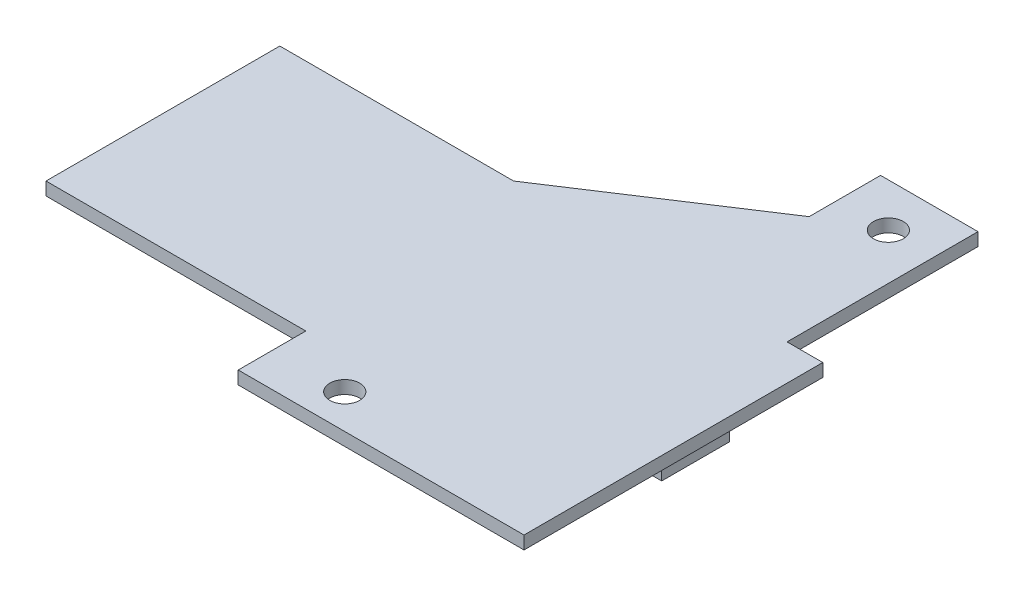
ISO-10303-21;
HEADER;
FILE_DESCRIPTION(('STEP AP214'),'2;1');
FILE_NAME('part.step','',(''),(''),'','','');
FILE_SCHEMA(('AUTOMOTIVE_DESIGN { 1 0 10303 214 1 1 1 1 }'));
ENDSEC;
DATA;
#1=APPLICATION_CONTEXT('core data for automotive mechanical design processes');
#2=APPLICATION_PROTOCOL_DEFINITION('international standard','automotive_design',2000,#1);
#3=PRODUCT_CONTEXT('',#1,'mechanical');
#4=PRODUCT('Part','Part','',(#3));
#5=PRODUCT_RELATED_PRODUCT_CATEGORY('part','',(#4));
#6=PRODUCT_DEFINITION_FORMATION('','',#4);
#7=PRODUCT_DEFINITION_CONTEXT('part definition',#1,'design');
#8=PRODUCT_DEFINITION('design','',#6,#7);
#9=PRODUCT_DEFINITION_SHAPE('','',#8);
#10=(LENGTH_UNIT() NAMED_UNIT(*) SI_UNIT(.MILLI.,.METRE.));
#11=(NAMED_UNIT(*) PLANE_ANGLE_UNIT() SI_UNIT($,.RADIAN.));
#12=(NAMED_UNIT(*) SI_UNIT($,.STERADIAN.) SOLID_ANGLE_UNIT());
#13=UNCERTAINTY_MEASURE_WITH_UNIT(LENGTH_MEASURE(1.E-05),#10,'distance_accuracy_value','');
#14=(GEOMETRIC_REPRESENTATION_CONTEXT(3) GLOBAL_UNCERTAINTY_ASSIGNED_CONTEXT((#13)) GLOBAL_UNIT_ASSIGNED_CONTEXT((#10,
#11,#12)) REPRESENTATION_CONTEXT('',''));
#15=CARTESIAN_POINT('',(0.,0.,0.));
#16=DIRECTION('',(0.,0.,1.));
#17=DIRECTION('',(1.,0.,0.));
#18=AXIS2_PLACEMENT_3D('',#15,#16,#17);
#19=CARTESIAN_POINT('',(0.,0.,0.));
#20=DIRECTION('',(0.,-1.,0.));
#21=DIRECTION('',(0.,0.,-1.));
#22=AXIS2_PLACEMENT_3D('',#19,#20,#21);
#23=PLANE('',#22);
#24=CARTESIAN_POINT('',(25.55,0.,2.55));
#25=DIRECTION('',(0.,1.,0.));
#26=DIRECTION('',(0.,0.,1.));
#27=AXIS2_PLACEMENT_3D('',#24,#25,#26);
#28=CIRCLE('',#27,1.15);
#29=CARTESIAN_POINT('',(25.55,0.,3.7));
#30=VERTEX_POINT('',#29);
#31=EDGE_CURVE('E254',#30,#30,#28,.T.);
#32=ORIENTED_EDGE('',*,*,#31,.T.);
#33=EDGE_LOOP('',(#32));
#34=FACE_BOUND('',#33,.T.);
#35=CARTESIAN_POINT('',(35.7,0.,-29.15));
#36=DIRECTION('',(0.,1.,0.));
#37=DIRECTION('',(0.,0.,1.));
#38=AXIS2_PLACEMENT_3D('',#35,#36,#37);
#39=CIRCLE('',#38,1.15);
#40=CARTESIAN_POINT('',(35.7,0.,-28.));
#41=VERTEX_POINT('',#40);
#42=EDGE_CURVE('E168',#41,#41,#39,.T.);
#43=ORIENTED_EDGE('',*,*,#42,.T.);
#44=EDGE_LOOP('',(#43));
#45=FACE_BOUND('',#44,.T.);
#46=DIRECTION('',(1.,0.,0.));
#47=VECTOR('',#46,1.);
#48=CARTESIAN_POINT('',(20.,0.,0.));
#49=LINE('',#48,#47);
#50=CARTESIAN_POINT('',(0.,0.,0.));
#51=VERTEX_POINT('',#50);
#52=CARTESIAN_POINT('',(20.,0.,0.));
#53=VERTEX_POINT('',#52);
#54=EDGE_CURVE('E164',#51,#53,#49,.T.);
#55=ORIENTED_EDGE('',*,*,#54,.F.);
#56=DIRECTION('',(0.,0.,1.));
#57=VECTOR('',#56,1.);
#58=CARTESIAN_POINT('',(0.,0.,0.));
#59=LINE('',#58,#57);
#60=CARTESIAN_POINT('',(0.,0.,-18.));
#61=VERTEX_POINT('',#60);
#62=EDGE_CURVE('E103',#61,#51,#59,.T.);
#63=ORIENTED_EDGE('',*,*,#62,.F.);
#64=DIRECTION('',(-1.,0.,0.));
#65=VECTOR('',#64,1.);
#66=CARTESIAN_POINT('',(0.,0.,-18.));
#67=LINE('',#66,#65);
#68=CARTESIAN_POINT('',(18.,0.,-18.));
#69=VERTEX_POINT('',#68);
#70=EDGE_CURVE('E183',#69,#61,#67,.T.);
#71=ORIENTED_EDGE('',*,*,#70,.F.);
#72=DIRECTION('',(-0.836701516894204,0.,0.547659174694388));
#73=VECTOR('',#72,1.);
#74=CARTESIAN_POINT('',(18.,0.,-18.));
#75=LINE('',#74,#73);
#76=CARTESIAN_POINT('',(31.75,0.,-27.));
#77=VERTEX_POINT('',#76);
#78=EDGE_CURVE('E152',#77,#69,#75,.T.);
#79=ORIENTED_EDGE('',*,*,#78,.F.);
#80=DIRECTION('',(0.,0.,1.));
#81=VECTOR('',#80,1.);
#82=CARTESIAN_POINT('',(31.75,0.,-27.));
#83=LINE('',#82,#81);
#84=CARTESIAN_POINT('',(31.75,0.,-32.5));
#85=VERTEX_POINT('',#84);
#86=EDGE_CURVE('E180',#85,#77,#83,.T.);
#87=ORIENTED_EDGE('',*,*,#86,.F.);
#88=DIRECTION('',(-1.,0.,0.));
#89=VECTOR('',#88,1.);
#90=CARTESIAN_POINT('',(31.75,0.,-32.5));
#91=LINE('',#90,#89);
#92=CARTESIAN_POINT('',(39.25,0.,-32.5));
#93=VERTEX_POINT('',#92);
#94=EDGE_CURVE('E178',#93,#85,#91,.T.);
#95=ORIENTED_EDGE('',*,*,#94,.F.);
#96=DIRECTION('',(0.,0.,-1.));
#97=VECTOR('',#96,1.);
#98=CARTESIAN_POINT('',(39.25,0.,-32.5));
#99=LINE('',#98,#97);
#100=CARTESIAN_POINT('',(39.25,0.,-17.8));
#101=VERTEX_POINT('',#100);
#102=EDGE_CURVE('E176',#101,#93,#99,.T.);
#103=ORIENTED_EDGE('',*,*,#102,.F.);
#104=DIRECTION('',(-1.,0.,0.));
#105=VECTOR('',#104,1.);
#106=CARTESIAN_POINT('',(39.25,0.,-17.8));
#107=LINE('',#106,#105);
#108=CARTESIAN_POINT('',(42.,0.,-17.8));
#109=VERTEX_POINT('',#108);
#110=EDGE_CURVE('E174',#109,#101,#107,.T.);
#111=ORIENTED_EDGE('',*,*,#110,.F.);
#112=DIRECTION('',(0.,0.,-1.));
#113=VECTOR('',#112,1.);
#114=CARTESIAN_POINT('',(42.,0.,-17.8));
#115=LINE('',#114,#113);
#116=CARTESIAN_POINT('',(42.,0.,5.2));
#117=VERTEX_POINT('',#116);
#118=EDGE_CURVE('E172',#117,#109,#115,.T.);
#119=ORIENTED_EDGE('',*,*,#118,.F.);
#120=DIRECTION('',(1.,0.,0.));
#121=VECTOR('',#120,1.);
#122=CARTESIAN_POINT('',(42.,0.,5.2));
#123=LINE('',#122,#121);
#124=CARTESIAN_POINT('',(20.,0.,5.2));
#125=VERTEX_POINT('',#124);
#126=EDGE_CURVE('E170',#125,#117,#123,.T.);
#127=ORIENTED_EDGE('',*,*,#126,.F.);
#128=DIRECTION('',(0.,0.,1.));
#129=VECTOR('',#128,1.);
#130=CARTESIAN_POINT('',(20.,0.,5.2));
#131=LINE('',#130,#129);
#132=EDGE_CURVE('E167',#53,#125,#131,.T.);
#133=ORIENTED_EDGE('',*,*,#132,.F.);
#134=EDGE_LOOP('',(#55,#63,#71,#79,#87,#95,#103,#111,#119,#127,#133));
#135=FACE_BOUND('',#134,.T.);
#136=DIRECTION('',(1.,0.,0.));
#137=VECTOR('',#136,1.);
#138=CARTESIAN_POINT('',(41.,0.,-11.6));
#139=LINE('',#138,#137);
#140=CARTESIAN_POINT('',(35.8,0.,-11.6));
#141=VERTEX_POINT('',#140);
#142=CARTESIAN_POINT('',(41.,0.,-11.6));
#143=VERTEX_POINT('',#142);
#144=EDGE_CURVE('E278',#141,#143,#139,.T.);
#145=ORIENTED_EDGE('',*,*,#144,.F.);
#146=DIRECTION('',(0.,0.,-1.));
#147=VECTOR('',#146,1.);
#148=CARTESIAN_POINT('',(35.8,0.,-11.6));
#149=LINE('',#148,#147);
#150=CARTESIAN_POINT('',(35.8,0.,-6.4));
#151=VERTEX_POINT('',#150);
#152=EDGE_CURVE('E281',#151,#141,#149,.T.);
#153=ORIENTED_EDGE('',*,*,#152,.F.);
#154=DIRECTION('',(-1.,0.,0.));
#155=VECTOR('',#154,1.);
#156=CARTESIAN_POINT('',(41.,0.,-6.4));
#157=LINE('',#156,#155);
#158=CARTESIAN_POINT('',(41.,0.,-6.4));
#159=VERTEX_POINT('',#158);
#160=EDGE_CURVE('E273',#159,#151,#157,.T.);
#161=ORIENTED_EDGE('',*,*,#160,.F.);
#162=DIRECTION('',(0.,0.,1.));
#163=VECTOR('',#162,1.);
#164=CARTESIAN_POINT('',(41.,0.,-11.6));
#165=LINE('',#164,#163);
#166=EDGE_CURVE('E276',#143,#159,#165,.T.);
#167=ORIENTED_EDGE('',*,*,#166,.F.);
#168=EDGE_LOOP('',(#145,#153,#161,#167));
#169=FACE_BOUND('',#168,.T.);
#170=ADVANCED_FACE('F37',(#34,#45,#135,#169),#23,.T.);
#171=CARTESIAN_POINT('',(20.,1.,0.));
#172=DIRECTION('',(0.,0.,-1.));
#173=DIRECTION('',(-1.,0.,0.));
#174=AXIS2_PLACEMENT_3D('',#171,#172,#173);
#175=PLANE('',#174);
#176=ORIENTED_EDGE('',*,*,#54,.T.);
#177=DIRECTION('',(0.,-1.,0.));
#178=VECTOR('',#177,1.);
#179=CARTESIAN_POINT('',(20.,1.,0.));
#180=LINE('',#179,#178);
#181=CARTESIAN_POINT('',(20.,1.,0.));
#182=VERTEX_POINT('',#181);
#183=EDGE_CURVE('E11',#182,#53,#180,.T.);
#184=ORIENTED_EDGE('',*,*,#183,.F.);
#185=DIRECTION('',(1.,0.,0.));
#186=VECTOR('',#185,1.);
#187=CARTESIAN_POINT('',(20.,1.,0.));
#188=LINE('',#187,#186);
#189=CARTESIAN_POINT('',(0.,1.,0.));
#190=VERTEX_POINT('',#189);
#191=EDGE_CURVE('E186',#190,#182,#188,.T.);
#192=ORIENTED_EDGE('',*,*,#191,.F.);
#193=DIRECTION('',(0.,-1.,0.));
#194=VECTOR('',#193,1.);
#195=CARTESIAN_POINT('',(0.,1.,0.));
#196=LINE('',#195,#194);
#197=EDGE_CURVE('E160',#190,#51,#196,.T.);
#198=ORIENTED_EDGE('',*,*,#197,.T.);
#199=EDGE_LOOP('',(#176,#184,#192,#198));
#200=FACE_BOUND('',#199,.T.);
#201=ADVANCED_FACE('F39',(#200),#175,.F.);
#202=CARTESIAN_POINT('',(20.,1.,5.2));
#203=DIRECTION('',(1.,0.,0.));
#204=DIRECTION('',(0.,0.,-1.));
#205=AXIS2_PLACEMENT_3D('',#202,#203,#204);
#206=PLANE('',#205);
#207=ORIENTED_EDGE('',*,*,#132,.T.);
#208=DIRECTION('',(0.,-1.,0.));
#209=VECTOR('',#208,1.);
#210=CARTESIAN_POINT('',(20.,1.,5.2));
#211=LINE('',#210,#209);
#212=CARTESIAN_POINT('',(20.,1.,5.2));
#213=VERTEX_POINT('',#212);
#214=EDGE_CURVE('E45',#213,#125,#211,.T.);
#215=ORIENTED_EDGE('',*,*,#214,.F.);
#216=DIRECTION('',(0.,0.,1.));
#217=VECTOR('',#216,1.);
#218=CARTESIAN_POINT('',(20.,1.,5.2));
#219=LINE('',#218,#217);
#220=EDGE_CURVE('E111',#182,#213,#219,.T.);
#221=ORIENTED_EDGE('',*,*,#220,.F.);
#222=ORIENTED_EDGE('',*,*,#183,.T.);
#223=EDGE_LOOP('',(#207,#215,#221,#222));
#224=FACE_BOUND('',#223,.T.);
#225=ADVANCED_FACE('F328',(#224),#206,.F.);
#226=CARTESIAN_POINT('',(42.,1.,5.2));
#227=DIRECTION('',(0.,0.,-1.));
#228=DIRECTION('',(-1.,0.,0.));
#229=AXIS2_PLACEMENT_3D('',#226,#227,#228);
#230=PLANE('',#229);
#231=ORIENTED_EDGE('',*,*,#126,.T.);
#232=DIRECTION('',(0.,-1.,0.));
#233=VECTOR('',#232,1.);
#234=CARTESIAN_POINT('',(42.,1.,5.2));
#235=LINE('',#234,#233);
#236=CARTESIAN_POINT('',(42.,1.,5.2));
#237=VERTEX_POINT('',#236);
#238=EDGE_CURVE('E202',#237,#117,#235,.T.);
#239=ORIENTED_EDGE('',*,*,#238,.F.);
#240=DIRECTION('',(1.,0.,0.));
#241=VECTOR('',#240,1.);
#242=CARTESIAN_POINT('',(42.,1.,5.2));
#243=LINE('',#242,#241);
#244=EDGE_CURVE('E210',#213,#237,#243,.T.);
#245=ORIENTED_EDGE('',*,*,#244,.F.);
#246=ORIENTED_EDGE('',*,*,#214,.T.);
#247=EDGE_LOOP('',(#231,#239,#245,#246));
#248=FACE_BOUND('',#247,.T.);
#249=ADVANCED_FACE('F208',(#248),#230,.F.);
#250=CARTESIAN_POINT('',(42.,1.,-17.8));
#251=DIRECTION('',(-1.,0.,0.));
#252=DIRECTION('',(0.,0.,1.));
#253=AXIS2_PLACEMENT_3D('',#250,#251,#252);
#254=PLANE('',#253);
#255=ORIENTED_EDGE('',*,*,#118,.T.);
#256=DIRECTION('',(0.,-1.,0.));
#257=VECTOR('',#256,1.);
#258=CARTESIAN_POINT('',(42.,1.,-17.8));
#259=LINE('',#258,#257);
#260=CARTESIAN_POINT('',(42.,1.,-17.8));
#261=VERTEX_POINT('',#260);
#262=EDGE_CURVE('E199',#261,#109,#259,.T.);
#263=ORIENTED_EDGE('',*,*,#262,.F.);
#264=DIRECTION('',(0.,0.,-1.));
#265=VECTOR('',#264,1.);
#266=CARTESIAN_POINT('',(42.,1.,-17.8));
#267=LINE('',#266,#265);
#268=EDGE_CURVE('E228',#237,#261,#267,.T.);
#269=ORIENTED_EDGE('',*,*,#268,.F.);
#270=ORIENTED_EDGE('',*,*,#238,.T.);
#271=EDGE_LOOP('',(#255,#263,#269,#270));
#272=FACE_BOUND('',#271,.T.);
#273=ADVANCED_FACE('F219',(#272),#254,.F.);
#274=CARTESIAN_POINT('',(39.25,1.,-17.8));
#275=DIRECTION('',(0.,0.,1.));
#276=DIRECTION('',(1.,0.,0.));
#277=AXIS2_PLACEMENT_3D('',#274,#275,#276);
#278=PLANE('',#277);
#279=ORIENTED_EDGE('',*,*,#110,.T.);
#280=DIRECTION('',(0.,-1.,0.));
#281=VECTOR('',#280,1.);
#282=CARTESIAN_POINT('',(39.25,1.,-17.8));
#283=LINE('',#282,#281);
#284=CARTESIAN_POINT('',(39.25,1.,-17.8));
#285=VERTEX_POINT('',#284);
#286=EDGE_CURVE('E196',#285,#101,#283,.T.);
#287=ORIENTED_EDGE('',*,*,#286,.F.);
#288=DIRECTION('',(-1.,0.,0.));
#289=VECTOR('',#288,1.);
#290=CARTESIAN_POINT('',(39.25,1.,-17.8));
#291=LINE('',#290,#289);
#292=EDGE_CURVE('E225',#261,#285,#291,.T.);
#293=ORIENTED_EDGE('',*,*,#292,.F.);
#294=ORIENTED_EDGE('',*,*,#262,.T.);
#295=EDGE_LOOP('',(#279,#287,#293,#294));
#296=FACE_BOUND('',#295,.T.);
#297=ADVANCED_FACE('F223',(#296),#278,.F.);
#298=CARTESIAN_POINT('',(39.25,1.,-32.5));
#299=DIRECTION('',(-1.,0.,0.));
#300=DIRECTION('',(0.,0.,1.));
#301=AXIS2_PLACEMENT_3D('',#298,#299,#300);
#302=PLANE('',#301);
#303=ORIENTED_EDGE('',*,*,#102,.T.);
#304=DIRECTION('',(0.,-1.,0.));
#305=VECTOR('',#304,1.);
#306=CARTESIAN_POINT('',(39.25,1.,-32.5));
#307=LINE('',#306,#305);
#308=CARTESIAN_POINT('',(39.25,1.,-32.5));
#309=VERTEX_POINT('',#308);
#310=EDGE_CURVE('E193',#309,#93,#307,.T.);
#311=ORIENTED_EDGE('',*,*,#310,.F.);
#312=DIRECTION('',(0.,0.,-1.));
#313=VECTOR('',#312,1.);
#314=CARTESIAN_POINT('',(39.25,1.,-32.5));
#315=LINE('',#314,#313);
#316=EDGE_CURVE('E227',#285,#309,#315,.T.);
#317=ORIENTED_EDGE('',*,*,#316,.F.);
#318=ORIENTED_EDGE('',*,*,#286,.T.);
#319=EDGE_LOOP('',(#303,#311,#317,#318));
#320=FACE_BOUND('',#319,.T.);
#321=ADVANCED_FACE('F343',(#320),#302,.F.);
#322=CARTESIAN_POINT('',(31.75,1.,-32.5));
#323=DIRECTION('',(0.,0.,1.));
#324=DIRECTION('',(1.,0.,0.));
#325=AXIS2_PLACEMENT_3D('',#322,#323,#324);
#326=PLANE('',#325);
#327=ORIENTED_EDGE('',*,*,#94,.T.);
#328=DIRECTION('',(0.,-1.,0.));
#329=VECTOR('',#328,1.);
#330=CARTESIAN_POINT('',(31.75,1.,-32.5));
#331=LINE('',#330,#329);
#332=CARTESIAN_POINT('',(31.75,1.,-32.5));
#333=VERTEX_POINT('',#332);
#334=EDGE_CURVE('E190',#333,#85,#331,.T.);
#335=ORIENTED_EDGE('',*,*,#334,.F.);
#336=DIRECTION('',(-1.,0.,0.));
#337=VECTOR('',#336,1.);
#338=CARTESIAN_POINT('',(31.75,1.,-32.5));
#339=LINE('',#338,#337);
#340=EDGE_CURVE('E230',#309,#333,#339,.T.);
#341=ORIENTED_EDGE('',*,*,#340,.F.);
#342=ORIENTED_EDGE('',*,*,#310,.T.);
#343=EDGE_LOOP('',(#327,#335,#341,#342));
#344=FACE_BOUND('',#343,.T.);
#345=ADVANCED_FACE('F239',(#344),#326,.F.);
#346=CARTESIAN_POINT('',(31.75,1.,-27.));
#347=DIRECTION('',(1.,0.,0.));
#348=DIRECTION('',(0.,0.,-1.));
#349=AXIS2_PLACEMENT_3D('',#346,#347,#348);
#350=PLANE('',#349);
#351=ORIENTED_EDGE('',*,*,#86,.T.);
#352=DIRECTION('',(0.,-1.,0.));
#353=VECTOR('',#352,1.);
#354=CARTESIAN_POINT('',(31.75,1.,-27.));
#355=LINE('',#354,#353);
#356=CARTESIAN_POINT('',(31.75,1.,-27.));
#357=VERTEX_POINT('',#356);
#358=EDGE_CURVE('E155',#357,#77,#355,.T.);
#359=ORIENTED_EDGE('',*,*,#358,.F.);
#360=DIRECTION('',(0.,0.,1.));
#361=VECTOR('',#360,1.);
#362=CARTESIAN_POINT('',(31.75,1.,-27.));
#363=LINE('',#362,#361);
#364=EDGE_CURVE('E143',#333,#357,#363,.T.);
#365=ORIENTED_EDGE('',*,*,#364,.F.);
#366=ORIENTED_EDGE('',*,*,#334,.T.);
#367=EDGE_LOOP('',(#351,#359,#365,#366));
#368=FACE_BOUND('',#367,.T.);
#369=ADVANCED_FACE('F243',(#368),#350,.F.);
#370=CARTESIAN_POINT('',(18.,1.,-18.));
#371=DIRECTION('',(0.547659174694388,0.,0.836701516894204));
#372=DIRECTION('',(0.836701516894204,0.,-0.547659174694388));
#373=AXIS2_PLACEMENT_3D('',#370,#371,#372);
#374=PLANE('',#373);
#375=ORIENTED_EDGE('',*,*,#78,.T.);
#376=DIRECTION('',(0.,-1.,0.));
#377=VECTOR('',#376,1.);
#378=CARTESIAN_POINT('',(18.,1.,-18.));
#379=LINE('',#378,#377);
#380=CARTESIAN_POINT('',(18.,1.,-18.));
#381=VERTEX_POINT('',#380);
#382=EDGE_CURVE('E149',#381,#69,#379,.T.);
#383=ORIENTED_EDGE('',*,*,#382,.F.);
#384=DIRECTION('',(-0.836701516894204,0.,0.547659174694388));
#385=VECTOR('',#384,1.);
#386=CARTESIAN_POINT('',(18.,1.,-18.));
#387=LINE('',#386,#385);
#388=EDGE_CURVE('E136',#357,#381,#387,.T.);
#389=ORIENTED_EDGE('',*,*,#388,.F.);
#390=ORIENTED_EDGE('',*,*,#358,.T.);
#391=EDGE_LOOP('',(#375,#383,#389,#390));
#392=FACE_BOUND('',#391,.T.);
#393=ADVANCED_FACE('F150',(#392),#374,.F.);
#394=CARTESIAN_POINT('',(0.,1.,-18.));
#395=DIRECTION('',(0.,0.,1.));
#396=DIRECTION('',(1.,0.,0.));
#397=AXIS2_PLACEMENT_3D('',#394,#395,#396);
#398=PLANE('',#397);
#399=ORIENTED_EDGE('',*,*,#70,.T.);
#400=DIRECTION('',(0.,-1.,0.));
#401=VECTOR('',#400,1.);
#402=CARTESIAN_POINT('',(0.,1.,-18.));
#403=LINE('',#402,#401);
#404=CARTESIAN_POINT('',(0.,1.,-18.));
#405=VERTEX_POINT('',#404);
#406=EDGE_CURVE('E156',#405,#61,#403,.T.);
#407=ORIENTED_EDGE('',*,*,#406,.F.);
#408=DIRECTION('',(-1.,0.,0.));
#409=VECTOR('',#408,1.);
#410=CARTESIAN_POINT('',(0.,1.,-18.));
#411=LINE('',#410,#409);
#412=EDGE_CURVE('E140',#381,#405,#411,.T.);
#413=ORIENTED_EDGE('',*,*,#412,.F.);
#414=ORIENTED_EDGE('',*,*,#382,.T.);
#415=EDGE_LOOP('',(#399,#407,#413,#414));
#416=FACE_BOUND('',#415,.T.);
#417=ADVANCED_FACE('F158',(#416),#398,.F.);
#418=CARTESIAN_POINT('',(0.,1.,0.));
#419=DIRECTION('',(1.,0.,0.));
#420=DIRECTION('',(0.,0.,-1.));
#421=AXIS2_PLACEMENT_3D('',#418,#419,#420);
#422=PLANE('',#421);
#423=ORIENTED_EDGE('',*,*,#62,.T.);
#424=ORIENTED_EDGE('',*,*,#197,.F.);
#425=DIRECTION('',(0.,0.,1.));
#426=VECTOR('',#425,1.);
#427=CARTESIAN_POINT('',(0.,1.,0.));
#428=LINE('',#427,#426);
#429=EDGE_CURVE('E61',#405,#190,#428,.T.);
#430=ORIENTED_EDGE('',*,*,#429,.F.);
#431=ORIENTED_EDGE('',*,*,#406,.T.);
#432=EDGE_LOOP('',(#423,#424,#430,#431));
#433=FACE_BOUND('',#432,.T.);
#434=ADVANCED_FACE('F244',(#433),#422,.F.);
#435=CARTESIAN_POINT('',(0.,1.,0.));
#436=DIRECTION('',(0.,-1.,0.));
#437=DIRECTION('',(0.,0.,-1.));
#438=AXIS2_PLACEMENT_3D('',#435,#436,#437);
#439=PLANE('',#438);
#440=CARTESIAN_POINT('',(25.55,1.,2.55));
#441=DIRECTION('',(0.,1.,0.));
#442=DIRECTION('',(0.,0.,1.));
#443=AXIS2_PLACEMENT_3D('',#440,#441,#442);
#444=CIRCLE('',#443,1.15);
#445=CARTESIAN_POINT('',(25.55,1.,3.7));
#446=VERTEX_POINT('',#445);
#447=EDGE_CURVE('E257',#446,#446,#444,.T.);
#448=ORIENTED_EDGE('',*,*,#447,.F.);
#449=EDGE_LOOP('',(#448));
#450=FACE_BOUND('',#449,.T.);
#451=CARTESIAN_POINT('',(35.7,1.,-29.15));
#452=DIRECTION('',(0.,1.,0.));
#453=DIRECTION('',(0.,0.,1.));
#454=AXIS2_PLACEMENT_3D('',#451,#452,#453);
#455=CIRCLE('',#454,1.15);
#456=CARTESIAN_POINT('',(35.7,1.,-28.));
#457=VERTEX_POINT('',#456);
#458=EDGE_CURVE('E251',#457,#457,#455,.T.);
#459=ORIENTED_EDGE('',*,*,#458,.F.);
#460=EDGE_LOOP('',(#459));
#461=FACE_BOUND('',#460,.T.);
#462=ORIENTED_EDGE('',*,*,#191,.T.);
#463=ORIENTED_EDGE('',*,*,#220,.T.);
#464=ORIENTED_EDGE('',*,*,#244,.T.);
#465=ORIENTED_EDGE('',*,*,#268,.T.);
#466=ORIENTED_EDGE('',*,*,#292,.T.);
#467=ORIENTED_EDGE('',*,*,#316,.T.);
#468=ORIENTED_EDGE('',*,*,#340,.T.);
#469=ORIENTED_EDGE('',*,*,#364,.T.);
#470=ORIENTED_EDGE('',*,*,#388,.T.);
#471=ORIENTED_EDGE('',*,*,#412,.T.);
#472=ORIENTED_EDGE('',*,*,#429,.T.);
#473=EDGE_LOOP('',(#462,#463,#464,#465,#466,#467,#468,#469,#470,#471,#472));
#474=FACE_BOUND('',#473,.T.);
#475=ADVANCED_FACE('F138',(#450,#461,#474),#439,.F.);
#476=CARTESIAN_POINT('',(35.7,0.,-29.15));
#477=DIRECTION('',(0.,1.,0.));
#478=DIRECTION('',(0.,0.,1.));
#479=AXIS2_PLACEMENT_3D('',#476,#477,#478);
#480=CYLINDRICAL_SURFACE('',#479,1.15);
#481=ORIENTED_EDGE('',*,*,#42,.F.);
#482=EDGE_LOOP('',(#481));
#483=FACE_BOUND('',#482,.T.);
#484=ORIENTED_EDGE('',*,*,#458,.T.);
#485=EDGE_LOOP('',(#484));
#486=FACE_BOUND('',#485,.T.);
#487=ADVANCED_FACE('F400',(#483,#486),#480,.F.);
#488=CARTESIAN_POINT('',(25.55,0.,2.55));
#489=DIRECTION('',(0.,1.,0.));
#490=DIRECTION('',(0.,0.,1.));
#491=AXIS2_PLACEMENT_3D('',#488,#489,#490);
#492=CYLINDRICAL_SURFACE('',#491,1.15);
#493=ORIENTED_EDGE('',*,*,#31,.F.);
#494=EDGE_LOOP('',(#493));
#495=FACE_BOUND('',#494,.T.);
#496=ORIENTED_EDGE('',*,*,#447,.T.);
#497=EDGE_LOOP('',(#496));
#498=FACE_BOUND('',#497,.T.);
#499=ADVANCED_FACE('F407',(#495,#498),#492,.F.);
#500=CARTESIAN_POINT('',(35.8,-1.7,-11.6));
#501=DIRECTION('',(1.,0.,0.));
#502=DIRECTION('',(0.,0.,-1.));
#503=AXIS2_PLACEMENT_3D('',#500,#501,#502);
#504=PLANE('',#503);
#505=ORIENTED_EDGE('',*,*,#152,.T.);
#506=DIRECTION('',(0.,1.,0.));
#507=VECTOR('',#506,1.);
#508=CARTESIAN_POINT('',(35.8,-1.7,-11.6));
#509=LINE('',#508,#507);
#510=CARTESIAN_POINT('',(35.8,-1.7,-11.6));
#511=VERTEX_POINT('',#510);
#512=EDGE_CURVE('E260',#511,#141,#509,.T.);
#513=ORIENTED_EDGE('',*,*,#512,.F.);
#514=DIRECTION('',(0.,0.,-1.));
#515=VECTOR('',#514,1.);
#516=CARTESIAN_POINT('',(35.8,-1.7,-11.6));
#517=LINE('',#516,#515);
#518=CARTESIAN_POINT('',(35.8,-1.7,-6.4));
#519=VERTEX_POINT('',#518);
#520=EDGE_CURVE('E275',#519,#511,#517,.T.);
#521=ORIENTED_EDGE('',*,*,#520,.F.);
#522=DIRECTION('',(0.,1.,0.));
#523=VECTOR('',#522,1.);
#524=CARTESIAN_POINT('',(35.8,-1.7,-6.4));
#525=LINE('',#524,#523);
#526=EDGE_CURVE('E269',#519,#151,#525,.T.);
#527=ORIENTED_EDGE('',*,*,#526,.T.);
#528=EDGE_LOOP('',(#505,#513,#521,#527));
#529=FACE_BOUND('',#528,.T.);
#530=ADVANCED_FACE('F304',(#529),#504,.F.);
#531=CARTESIAN_POINT('',(41.,-1.7,-11.6));
#532=DIRECTION('',(0.,0.,1.));
#533=DIRECTION('',(1.,0.,0.));
#534=AXIS2_PLACEMENT_3D('',#531,#532,#533);
#535=PLANE('',#534);
#536=ORIENTED_EDGE('',*,*,#144,.T.);
#537=DIRECTION('',(0.,1.,0.));
#538=VECTOR('',#537,1.);
#539=CARTESIAN_POINT('',(41.,-1.7,-11.6));
#540=LINE('',#539,#538);
#541=CARTESIAN_POINT('',(41.,-1.7,-11.6));
#542=VERTEX_POINT('',#541);
#543=EDGE_CURVE('E265',#542,#143,#540,.T.);
#544=ORIENTED_EDGE('',*,*,#543,.F.);
#545=DIRECTION('',(1.,0.,0.));
#546=VECTOR('',#545,1.);
#547=CARTESIAN_POINT('',(41.,-1.7,-11.6));
#548=LINE('',#547,#546);
#549=EDGE_CURVE('E289',#511,#542,#548,.T.);
#550=ORIENTED_EDGE('',*,*,#549,.F.);
#551=ORIENTED_EDGE('',*,*,#512,.T.);
#552=EDGE_LOOP('',(#536,#544,#550,#551));
#553=FACE_BOUND('',#552,.T.);
#554=ADVANCED_FACE('F309',(#553),#535,.F.);
#555=CARTESIAN_POINT('',(41.,-1.7,-11.6));
#556=DIRECTION('',(-1.,0.,0.));
#557=DIRECTION('',(0.,0.,1.));
#558=AXIS2_PLACEMENT_3D('',#555,#556,#557);
#559=PLANE('',#558);
#560=ORIENTED_EDGE('',*,*,#166,.T.);
#561=DIRECTION('',(0.,1.,0.));
#562=VECTOR('',#561,1.);
#563=CARTESIAN_POINT('',(41.,-1.7,-6.4));
#564=LINE('',#563,#562);
#565=CARTESIAN_POINT('',(41.,-1.7,-6.4));
#566=VERTEX_POINT('',#565);
#567=EDGE_CURVE('E52',#566,#159,#564,.T.);
#568=ORIENTED_EDGE('',*,*,#567,.F.);
#569=DIRECTION('',(0.,0.,1.));
#570=VECTOR('',#569,1.);
#571=CARTESIAN_POINT('',(41.,-1.7,-11.6));
#572=LINE('',#571,#570);
#573=EDGE_CURVE('E286',#542,#566,#572,.T.);
#574=ORIENTED_EDGE('',*,*,#573,.F.);
#575=ORIENTED_EDGE('',*,*,#543,.T.);
#576=EDGE_LOOP('',(#560,#568,#574,#575));
#577=FACE_BOUND('',#576,.T.);
#578=ADVANCED_FACE('F318',(#577),#559,.F.);
#579=CARTESIAN_POINT('',(41.,-1.7,-6.4));
#580=DIRECTION('',(0.,0.,-1.));
#581=DIRECTION('',(-1.,0.,0.));
#582=AXIS2_PLACEMENT_3D('',#579,#580,#581);
#583=PLANE('',#582);
#584=ORIENTED_EDGE('',*,*,#160,.T.);
#585=ORIENTED_EDGE('',*,*,#526,.F.);
#586=DIRECTION('',(-1.,0.,0.));
#587=VECTOR('',#586,1.);
#588=CARTESIAN_POINT('',(41.,-1.7,-6.4));
#589=LINE('',#588,#587);
#590=EDGE_CURVE('E272',#566,#519,#589,.T.);
#591=ORIENTED_EDGE('',*,*,#590,.F.);
#592=ORIENTED_EDGE('',*,*,#567,.T.);
#593=EDGE_LOOP('',(#584,#585,#591,#592));
#594=FACE_BOUND('',#593,.T.);
#595=ADVANCED_FACE('F321',(#594),#583,.F.);
#596=CARTESIAN_POINT('',(0.,-1.7,0.));
#597=DIRECTION('',(0.,-1.,0.));
#598=DIRECTION('',(0.,0.,-1.));
#599=AXIS2_PLACEMENT_3D('',#596,#597,#598);
#600=PLANE('',#599);
#601=ORIENTED_EDGE('',*,*,#520,.T.);
#602=ORIENTED_EDGE('',*,*,#549,.T.);
#603=ORIENTED_EDGE('',*,*,#573,.T.);
#604=ORIENTED_EDGE('',*,*,#590,.T.);
#605=EDGE_LOOP('',(#601,#602,#603,#604));
#606=FACE_BOUND('',#605,.T.);
#607=ADVANCED_FACE('F297',(#606),#600,.T.);
#608=CLOSED_SHELL('',(#170,#201,#225,#249,#273,#297,#321,#345,#369,#393,#417,#434,#475,#487,
#499,#530,#554,#578,#595,#607));
#609=MANIFOLD_SOLID_BREP('B2',#608);
#610=ADVANCED_BREP_SHAPE_REPRESENTATION('',(#18,#609),#14);
#611=SHAPE_DEFINITION_REPRESENTATION(#9,#610);
ENDSEC;
END-ISO-10303-21;
